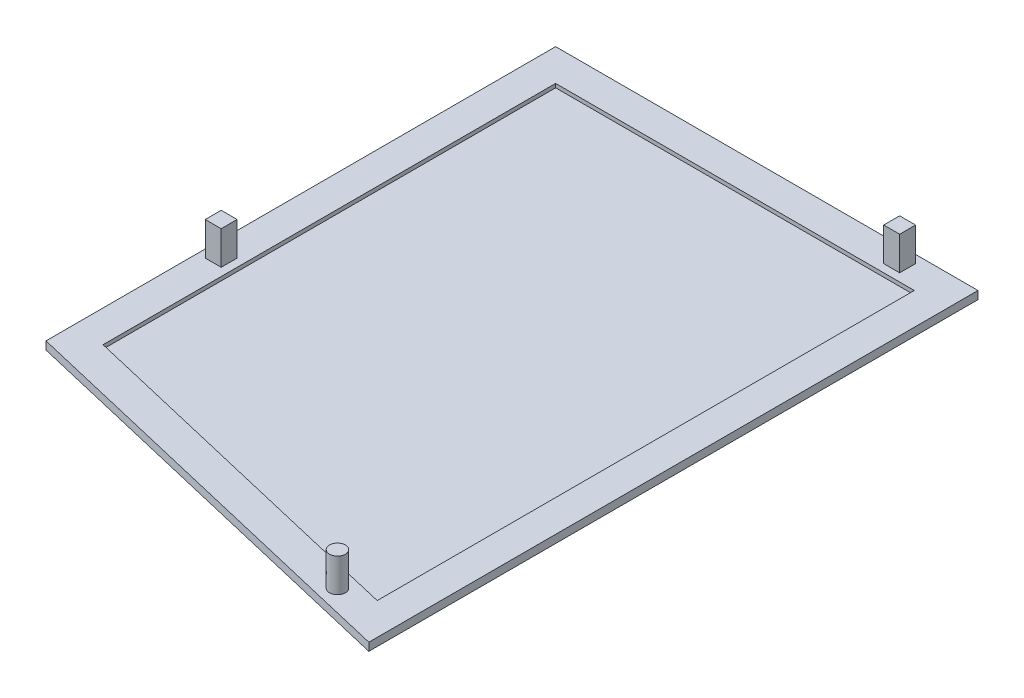
ISO-10303-21;
HEADER;
FILE_DESCRIPTION(('STEP AP214'),'2;1');
FILE_NAME('part.step','',(''),(''),'','','');
FILE_SCHEMA(('AUTOMOTIVE_DESIGN { 1 0 10303 214 1 1 1 1 }'));
ENDSEC;
DATA;
#1=APPLICATION_CONTEXT('core data for automotive mechanical design processes');
#2=APPLICATION_PROTOCOL_DEFINITION('international standard','automotive_design',2000,#1);
#3=PRODUCT_CONTEXT('',#1,'mechanical');
#4=PRODUCT('Part','Part','',(#3));
#5=PRODUCT_RELATED_PRODUCT_CATEGORY('part','',(#4));
#6=PRODUCT_DEFINITION_FORMATION('','',#4);
#7=PRODUCT_DEFINITION_CONTEXT('part definition',#1,'design');
#8=PRODUCT_DEFINITION('design','',#6,#7);
#9=PRODUCT_DEFINITION_SHAPE('','',#8);
#10=(LENGTH_UNIT() NAMED_UNIT(*) SI_UNIT(.MILLI.,.METRE.));
#11=(NAMED_UNIT(*) PLANE_ANGLE_UNIT() SI_UNIT($,.RADIAN.));
#12=(NAMED_UNIT(*) SI_UNIT($,.STERADIAN.) SOLID_ANGLE_UNIT());
#13=UNCERTAINTY_MEASURE_WITH_UNIT(LENGTH_MEASURE(1.E-05),#10,'distance_accuracy_value','');
#14=(GEOMETRIC_REPRESENTATION_CONTEXT(3) GLOBAL_UNCERTAINTY_ASSIGNED_CONTEXT((#13)) GLOBAL_UNIT_ASSIGNED_CONTEXT((#10,
#11,#12)) REPRESENTATION_CONTEXT('',''));
#15=CARTESIAN_POINT('',(0.,0.,0.));
#16=DIRECTION('',(0.,0.,1.));
#17=DIRECTION('',(1.,0.,0.));
#18=AXIS2_PLACEMENT_3D('',#15,#16,#17);
#19=CARTESIAN_POINT('',(66.3,1.25,15.6237913177201));
#20=DIRECTION('',(0.229370274159935,0.,-0.973339240620554));
#21=DIRECTION('',(-0.973339240620554,0.,-0.229370274159935));
#22=AXIS2_PLACEMENT_3D('',#19,#20,#21);
#23=PLANE('',#22);
#24=DIRECTION('',(0.973339240620554,0.,0.229370274159935));
#25=VECTOR('',#24,1.);
#26=CARTESIAN_POINT('',(66.3,0.,15.6237913177201));
#27=LINE('',#26,#25);
#28=CARTESIAN_POINT('',(0.,0.,0.));
#29=VERTEX_POINT('',#28);
#30=CARTESIAN_POINT('',(66.3,0.,15.6237913177201));
#31=VERTEX_POINT('',#30);
#32=EDGE_CURVE('E257',#29,#31,#27,.T.);
#33=ORIENTED_EDGE('',*,*,#32,.T.);
#34=DIRECTION('',(0.,-1.,0.));
#35=VECTOR('',#34,1.);
#36=CARTESIAN_POINT('',(66.3,1.25,15.6237913177201));
#37=LINE('',#36,#35);
#38=CARTESIAN_POINT('',(66.3,1.25,15.6237913177201));
#39=VERTEX_POINT('',#38);
#40=EDGE_CURVE('E11',#39,#31,#37,.T.);
#41=ORIENTED_EDGE('',*,*,#40,.F.);
#42=DIRECTION('',(0.973339240620554,0.,0.229370274159935));
#43=VECTOR('',#42,1.);
#44=CARTESIAN_POINT('',(66.3,1.25,15.6237913177201));
#45=LINE('',#44,#43);
#46=CARTESIAN_POINT('',(0.,1.25,0.));
#47=VERTEX_POINT('',#46);
#48=EDGE_CURVE('E258',#47,#39,#45,.T.);
#49=ORIENTED_EDGE('',*,*,#48,.F.);
#50=DIRECTION('',(0.,-1.,0.));
#51=VECTOR('',#50,1.);
#52=CARTESIAN_POINT('',(0.,1.25,0.));
#53=LINE('',#52,#51);
#54=EDGE_CURVE('E268',#47,#29,#53,.T.);
#55=ORIENTED_EDGE('',*,*,#54,.T.);
#56=EDGE_LOOP('',(#33,#41,#49,#55));
#57=FACE_BOUND('',#56,.T.);
#58=ADVANCED_FACE('F33',(#57),#23,.F.);
#59=CARTESIAN_POINT('',(66.3,1.25,-80.));
#60=DIRECTION('',(-1.,0.,0.));
#61=DIRECTION('',(0.,0.,1.));
#62=AXIS2_PLACEMENT_3D('',#59,#60,#61);
#63=PLANE('',#62);
#64=DIRECTION('',(0.,0.,-1.));
#65=VECTOR('',#64,1.);
#66=CARTESIAN_POINT('',(66.3,0.,-80.));
#67=LINE('',#66,#65);
#68=CARTESIAN_POINT('',(66.3,0.,-80.));
#69=VERTEX_POINT('',#68);
#70=EDGE_CURVE('E271',#31,#69,#67,.T.);
#71=ORIENTED_EDGE('',*,*,#70,.T.);
#72=DIRECTION('',(0.,-1.,0.));
#73=VECTOR('',#72,1.);
#74=CARTESIAN_POINT('',(66.3,1.25,-80.));
#75=LINE('',#74,#73);
#76=CARTESIAN_POINT('',(66.3,1.25,-80.));
#77=VERTEX_POINT('',#76);
#78=EDGE_CURVE('E40',#77,#69,#75,.T.);
#79=ORIENTED_EDGE('',*,*,#78,.F.);
#80=DIRECTION('',(0.,0.,-1.));
#81=VECTOR('',#80,1.);
#82=CARTESIAN_POINT('',(66.3,1.25,-80.));
#83=LINE('',#82,#81);
#84=EDGE_CURVE('E261',#39,#77,#83,.T.);
#85=ORIENTED_EDGE('',*,*,#84,.F.);
#86=ORIENTED_EDGE('',*,*,#40,.T.);
#87=EDGE_LOOP('',(#71,#79,#85,#86));
#88=FACE_BOUND('',#87,.T.);
#89=ADVANCED_FACE('F301',(#88),#63,.F.);
#90=CARTESIAN_POINT('',(0.,1.25,-80.));
#91=DIRECTION('',(0.,0.,1.));
#92=DIRECTION('',(1.,0.,0.));
#93=AXIS2_PLACEMENT_3D('',#90,#91,#92);
#94=PLANE('',#93);
#95=DIRECTION('',(-1.,0.,0.));
#96=VECTOR('',#95,1.);
#97=CARTESIAN_POINT('',(0.,0.,-80.));
#98=LINE('',#97,#96);
#99=CARTESIAN_POINT('',(0.,0.,-80.));
#100=VERTEX_POINT('',#99);
#101=EDGE_CURVE('E273',#69,#100,#98,.T.);
#102=ORIENTED_EDGE('',*,*,#101,.T.);
#103=DIRECTION('',(0.,-1.,0.));
#104=VECTOR('',#103,1.);
#105=CARTESIAN_POINT('',(0.,1.25,-80.));
#106=LINE('',#105,#104);
#107=CARTESIAN_POINT('',(0.,1.25,-80.));
#108=VERTEX_POINT('',#107);
#109=EDGE_CURVE('E278',#108,#100,#106,.T.);
#110=ORIENTED_EDGE('',*,*,#109,.F.);
#111=DIRECTION('',(-1.,0.,0.));
#112=VECTOR('',#111,1.);
#113=CARTESIAN_POINT('',(0.,1.25,-80.));
#114=LINE('',#113,#112);
#115=EDGE_CURVE('E264',#77,#108,#114,.T.);
#116=ORIENTED_EDGE('',*,*,#115,.F.);
#117=ORIENTED_EDGE('',*,*,#78,.T.);
#118=EDGE_LOOP('',(#102,#110,#116,#117));
#119=FACE_BOUND('',#118,.T.);
#120=ADVANCED_FACE('F285',(#119),#94,.F.);
#121=CARTESIAN_POINT('',(0.,1.25,0.));
#122=DIRECTION('',(1.,0.,0.));
#123=DIRECTION('',(0.,0.,-1.));
#124=AXIS2_PLACEMENT_3D('',#121,#122,#123);
#125=PLANE('',#124);
#126=DIRECTION('',(0.,0.,1.));
#127=VECTOR('',#126,1.);
#128=CARTESIAN_POINT('',(0.,0.,0.));
#129=LINE('',#128,#127);
#130=EDGE_CURVE('E262',#100,#29,#129,.T.);
#131=ORIENTED_EDGE('',*,*,#130,.T.);
#132=ORIENTED_EDGE('',*,*,#54,.F.);
#133=DIRECTION('',(0.,0.,1.));
#134=VECTOR('',#133,1.);
#135=CARTESIAN_POINT('',(0.,1.25,0.));
#136=LINE('',#135,#134);
#137=EDGE_CURVE('E266',#108,#47,#136,.T.);
#138=ORIENTED_EDGE('',*,*,#137,.F.);
#139=ORIENTED_EDGE('',*,*,#109,.T.);
#140=EDGE_LOOP('',(#131,#132,#138,#139));
#141=FACE_BOUND('',#140,.T.);
#142=ADVANCED_FACE('F294',(#141),#125,.F.);
#143=CARTESIAN_POINT('',(0.,1.25,0.));
#144=DIRECTION('',(0.,-1.,0.));
#145=DIRECTION('',(0.,0.,-1.));
#146=AXIS2_PLACEMENT_3D('',#143,#144,#145);
#147=PLANE('',#146);
#148=DIRECTION('',(0.,0.,1.));
#149=VECTOR('',#148,1.);
#150=CARTESIAN_POINT('',(5.,1.25,-75.));
#151=LINE('',#150,#149);
#152=CARTESIAN_POINT('',(5.,1.25,-75.));
#153=VERTEX_POINT('',#152);
#154=CARTESIAN_POINT('',(5.,1.25,-3.95869031925986));
#155=VERTEX_POINT('',#154);
#156=EDGE_CURVE('E174',#153,#155,#151,.T.);
#157=ORIENTED_EDGE('',*,*,#156,.F.);
#158=DIRECTION('',(-1.,0.,0.));
#159=VECTOR('',#158,1.);
#160=CARTESIAN_POINT('',(61.3,1.25,-75.));
#161=LINE('',#160,#159);
#162=CARTESIAN_POINT('',(61.3,1.25,-75.));
#163=VERTEX_POINT('',#162);
#164=EDGE_CURVE('E47',#163,#153,#161,.T.);
#165=ORIENTED_EDGE('',*,*,#164,.F.);
#166=DIRECTION('',(0.,0.,-1.));
#167=VECTOR('',#166,1.);
#168=CARTESIAN_POINT('',(61.3,1.25,9.30857138794438));
#169=LINE('',#168,#167);
#170=CARTESIAN_POINT('',(61.3,1.25,9.30857138794438));
#171=VERTEX_POINT('',#170);
#172=EDGE_CURVE('E165',#171,#163,#169,.T.);
#173=ORIENTED_EDGE('',*,*,#172,.F.);
#174=DIRECTION('',(0.973339240620554,0.,0.229370274159935));
#175=VECTOR('',#174,1.);
#176=CARTESIAN_POINT('',(5.,1.25,-3.95869031925986));
#177=LINE('',#176,#175);
#178=EDGE_CURVE('E168',#155,#171,#177,.T.);
#179=ORIENTED_EDGE('',*,*,#178,.F.);
#180=EDGE_LOOP('',(#157,#165,#173,#179));
#181=FACE_BOUND('',#180,.T.);
#182=DIRECTION('',(1.,0.,0.));
#183=VECTOR('',#182,1.);
#184=CARTESIAN_POINT('',(0.,1.25,-26.25));
#185=LINE('',#184,#183);
#186=CARTESIAN_POINT('',(1.25,1.25,-26.25));
#187=VERTEX_POINT('',#186);
#188=CARTESIAN_POINT('',(3.75,1.25,-26.25));
#189=VERTEX_POINT('',#188);
#190=EDGE_CURVE('E210',#187,#189,#185,.T.);
#191=ORIENTED_EDGE('',*,*,#190,.T.);
#192=DIRECTION('',(0.,0.,1.));
#193=VECTOR('',#192,1.);
#194=CARTESIAN_POINT('',(3.75,1.25,0.));
#195=LINE('',#194,#193);
#196=CARTESIAN_POINT('',(3.75,1.25,-23.75));
#197=VERTEX_POINT('',#196);
#198=EDGE_CURVE('E213',#189,#197,#195,.T.);
#199=ORIENTED_EDGE('',*,*,#198,.T.);
#200=DIRECTION('',(-1.,0.,0.));
#201=VECTOR('',#200,1.);
#202=CARTESIAN_POINT('',(0.,1.25,-23.75));
#203=LINE('',#202,#201);
#204=CARTESIAN_POINT('',(1.25,1.25,-23.75));
#205=VERTEX_POINT('',#204);
#206=EDGE_CURVE('E198',#197,#205,#203,.T.);
#207=ORIENTED_EDGE('',*,*,#206,.T.);
#208=DIRECTION('',(0.,0.,-1.));
#209=VECTOR('',#208,1.);
#210=CARTESIAN_POINT('',(1.25,1.25,0.));
#211=LINE('',#210,#209);
#212=EDGE_CURVE('E207',#205,#187,#211,.T.);
#213=ORIENTED_EDGE('',*,*,#212,.T.);
#214=EDGE_LOOP('',(#191,#199,#207,#213));
#215=FACE_BOUND('',#214,.T.);
#216=DIRECTION('',(1.,0.,0.));
#217=VECTOR('',#216,1.);
#218=CARTESIAN_POINT('',(0.,1.25,-78.75));
#219=LINE('',#218,#217);
#220=CARTESIAN_POINT('',(55.25,1.25,-78.75));
#221=VERTEX_POINT('',#220);
#222=CARTESIAN_POINT('',(57.75,1.25,-78.75));
#223=VERTEX_POINT('',#222);
#224=EDGE_CURVE('E245',#221,#223,#219,.T.);
#225=ORIENTED_EDGE('',*,*,#224,.T.);
#226=DIRECTION('',(0.,0.,1.));
#227=VECTOR('',#226,1.);
#228=CARTESIAN_POINT('',(57.75,1.25,0.));
#229=LINE('',#228,#227);
#230=CARTESIAN_POINT('',(57.75,1.25,-76.25));
#231=VERTEX_POINT('',#230);
#232=EDGE_CURVE('E248',#223,#231,#229,.T.);
#233=ORIENTED_EDGE('',*,*,#232,.T.);
#234=DIRECTION('',(-1.,0.,0.));
#235=VECTOR('',#234,1.);
#236=CARTESIAN_POINT('',(0.,1.25,-76.25));
#237=LINE('',#236,#235);
#238=CARTESIAN_POINT('',(55.25,1.25,-76.25));
#239=VERTEX_POINT('',#238);
#240=EDGE_CURVE('E232',#231,#239,#237,.T.);
#241=ORIENTED_EDGE('',*,*,#240,.T.);
#242=DIRECTION('',(0.,0.,-1.));
#243=VECTOR('',#242,1.);
#244=CARTESIAN_POINT('',(55.25,1.25,0.));
#245=LINE('',#244,#243);
#246=EDGE_CURVE('E242',#239,#221,#245,.T.);
#247=ORIENTED_EDGE('',*,*,#246,.T.);
#248=EDGE_LOOP('',(#225,#233,#241,#247));
#249=FACE_BOUND('',#248,.T.);
#250=CARTESIAN_POINT('',(56.5,1.25,10.7459147371557));
#251=DIRECTION('',(0.,-1.,0.));
#252=DIRECTION('',(0.,0.,-1.));
#253=AXIS2_PLACEMENT_3D('',#250,#251,#252);
#254=CIRCLE('',#253,1.25);
#255=CARTESIAN_POINT('',(56.5,1.25,9.49591473715566));
#256=VERTEX_POINT('',#255);
#257=EDGE_CURVE('E254',#256,#256,#254,.T.);
#258=ORIENTED_EDGE('',*,*,#257,.T.);
#259=EDGE_LOOP('',(#258));
#260=FACE_BOUND('',#259,.T.);
#261=ORIENTED_EDGE('',*,*,#48,.T.);
#262=ORIENTED_EDGE('',*,*,#84,.T.);
#263=ORIENTED_EDGE('',*,*,#115,.T.);
#264=ORIENTED_EDGE('',*,*,#137,.T.);
#265=EDGE_LOOP('',(#261,#262,#263,#264));
#266=FACE_BOUND('',#265,.T.);
#267=ADVANCED_FACE('F300',(#181,#215,#249,#260,#266),#147,.F.);
#268=CARTESIAN_POINT('',(0.,0.,0.));
#269=DIRECTION('',(0.,-1.,0.));
#270=DIRECTION('',(0.,0.,-1.));
#271=AXIS2_PLACEMENT_3D('',#268,#269,#270);
#272=PLANE('',#271);
#273=ORIENTED_EDGE('',*,*,#32,.F.);
#274=ORIENTED_EDGE('',*,*,#130,.F.);
#275=ORIENTED_EDGE('',*,*,#101,.F.);
#276=ORIENTED_EDGE('',*,*,#70,.F.);
#277=EDGE_LOOP('',(#273,#274,#275,#276));
#278=FACE_BOUND('',#277,.T.);
#279=ADVANCED_FACE('F291',(#278),#272,.T.);
#280=CARTESIAN_POINT('',(56.5,6.5,10.7459147371557));
#281=DIRECTION('',(0.,-1.,0.));
#282=DIRECTION('',(0.,0.,-1.));
#283=AXIS2_PLACEMENT_3D('',#280,#281,#282);
#284=CYLINDRICAL_SURFACE('',#283,1.25);
#285=CARTESIAN_POINT('',(56.5,6.5,10.7459147371557));
#286=DIRECTION('',(0.,-1.,0.));
#287=DIRECTION('',(0.,0.,-1.));
#288=AXIS2_PLACEMENT_3D('',#285,#286,#287);
#289=CIRCLE('',#288,1.25);
#290=CARTESIAN_POINT('',(56.5,6.5,9.49591473715566));
#291=VERTEX_POINT('',#290);
#292=EDGE_CURVE('E251',#291,#291,#289,.T.);
#293=CARTESIAN_POINT('',(56.5,6.5,9.49591473715566));
#294=CARTESIAN_POINT('',(56.5,6.4453125,9.49591473715566));
#295=CARTESIAN_POINT('',(56.5,6.390625,9.49591473715566));
#296=CARTESIAN_POINT('',(56.5,6.28125,9.49591473715566));
#297=CARTESIAN_POINT('',(56.5,6.2265625,9.49591473715566));
#298=CARTESIAN_POINT('',(56.5,6.1171875,9.49591473715566));
#299=CARTESIAN_POINT('',(56.5,6.0625,9.49591473715566));
#300=CARTESIAN_POINT('',(56.5,5.953125,9.49591473715566));
#301=CARTESIAN_POINT('',(56.5,5.8984375,9.49591473715566));
#302=CARTESIAN_POINT('',(56.5,5.7890625,9.49591473715566));
#303=CARTESIAN_POINT('',(56.5,5.734375,9.49591473715566));
#304=CARTESIAN_POINT('',(56.5,5.625,9.49591473715566));
#305=CARTESIAN_POINT('',(56.5,5.5703125,9.49591473715566));
#306=CARTESIAN_POINT('',(56.5,5.4609375,9.49591473715566));
#307=CARTESIAN_POINT('',(56.5,5.40625,9.49591473715566));
#308=CARTESIAN_POINT('',(56.5,5.296875,9.49591473715566));
#309=CARTESIAN_POINT('',(56.5,5.2421875,9.49591473715566));
#310=CARTESIAN_POINT('',(56.5,5.1328125,9.49591473715566));
#311=CARTESIAN_POINT('',(56.5,5.078125,9.49591473715566));
#312=CARTESIAN_POINT('',(56.5,4.96875,9.49591473715566));
#313=CARTESIAN_POINT('',(56.5,4.9140625,9.49591473715566));
#314=CARTESIAN_POINT('',(56.5,4.8046875,9.49591473715566));
#315=CARTESIAN_POINT('',(56.5,4.75,9.49591473715566));
#316=CARTESIAN_POINT('',(56.5,4.640625,9.49591473715566));
#317=CARTESIAN_POINT('',(56.5,4.5859375,9.49591473715566));
#318=CARTESIAN_POINT('',(56.5,4.4765625,9.49591473715566));
#319=CARTESIAN_POINT('',(56.5,4.421875,9.49591473715566));
#320=CARTESIAN_POINT('',(56.5,4.3125,9.49591473715566));
#321=CARTESIAN_POINT('',(56.5,4.2578125,9.49591473715566));
#322=CARTESIAN_POINT('',(56.5,4.1484375,9.49591473715566));
#323=CARTESIAN_POINT('',(56.5,4.09375,9.49591473715566));
#324=CARTESIAN_POINT('',(56.5,3.984375,9.49591473715566));
#325=CARTESIAN_POINT('',(56.5,3.9296875,9.49591473715566));
#326=CARTESIAN_POINT('',(56.5,3.8203125,9.49591473715566));
#327=CARTESIAN_POINT('',(56.5,3.765625,9.49591473715566));
#328=CARTESIAN_POINT('',(56.5,3.65625,9.49591473715566));
#329=CARTESIAN_POINT('',(56.5,3.6015625,9.49591473715566));
#330=CARTESIAN_POINT('',(56.5,3.4921875,9.49591473715566));
#331=CARTESIAN_POINT('',(56.5,3.4375,9.49591473715566));
#332=CARTESIAN_POINT('',(56.5,3.328125,9.49591473715566));
#333=CARTESIAN_POINT('',(56.5,3.2734375,9.49591473715566));
#334=CARTESIAN_POINT('',(56.5,3.1640625,9.49591473715566));
#335=CARTESIAN_POINT('',(56.5,3.109375,9.49591473715566));
#336=CARTESIAN_POINT('',(56.5,3.,9.49591473715566));
#337=CARTESIAN_POINT('',(56.5,2.9453125,9.49591473715566));
#338=CARTESIAN_POINT('',(56.5,2.8359375,9.49591473715566));
#339=CARTESIAN_POINT('',(56.5,2.78125,9.49591473715566));
#340=CARTESIAN_POINT('',(56.5,2.671875,9.49591473715566));
#341=CARTESIAN_POINT('',(56.5,2.6171875,9.49591473715566));
#342=CARTESIAN_POINT('',(56.5,2.5078125,9.49591473715566));
#343=CARTESIAN_POINT('',(56.5,2.453125,9.49591473715566));
#344=CARTESIAN_POINT('',(56.5,2.34375,9.49591473715566));
#345=CARTESIAN_POINT('',(56.5,2.2890625,9.49591473715566));
#346=CARTESIAN_POINT('',(56.5,2.1796875,9.49591473715566));
#347=CARTESIAN_POINT('',(56.5,2.125,9.49591473715566));
#348=CARTESIAN_POINT('',(56.5,2.015625,9.49591473715566));
#349=CARTESIAN_POINT('',(56.5,1.9609375,9.49591473715566));
#350=CARTESIAN_POINT('',(56.5,1.8515625,9.49591473715566));
#351=CARTESIAN_POINT('',(56.5,1.796875,9.49591473715566));
#352=CARTESIAN_POINT('',(56.5,1.6875,9.49591473715566));
#353=CARTESIAN_POINT('',(56.5,1.6328125,9.49591473715566));
#354=CARTESIAN_POINT('',(56.5,1.5234375,9.49591473715566));
#355=CARTESIAN_POINT('',(56.5,1.46875,9.49591473715566));
#356=CARTESIAN_POINT('',(56.5,1.359375,9.49591473715566));
#357=CARTESIAN_POINT('',(56.5,1.3046875,9.49591473715566));
#358=CARTESIAN_POINT('',(56.5,1.25,9.49591473715566));
#359=B_SPLINE_CURVE_WITH_KNOTS('',3,(#293,#294,#295,#296,#297,#298,#299,#300,#301,#302,#303,
#304,#305,#306,#307,#308,#309,#310,#311,#312,#313,#314,#315,#316,#317,#318,#319,#320,#321,#322,
#323,#324,#325,#326,#327,#328,#329,#330,#331,#332,#333,#334,#335,#336,#337,#338,#339,#340,#341,
#342,#343,#344,#345,#346,#347,#348,#349,#350,#351,#352,#353,#354,#355,#356,#357,#358),
.UNSPECIFIED.,.F.,.F.,(4,2,2,2,2,2,2,2,2,2,2,2,2,2,2,2,2,2,2,2,2,2,2,2,2,2,2,2,2,2,2,2,4),(0.,
0.1640625,0.328125,0.4921875,0.656250000000001,0.820312500000001,0.984375,1.1484375,1.3125,
1.4765625,1.640625,1.8046875,1.96875,2.1328125,2.296875,2.4609375,2.625,2.7890625,2.953125,
3.1171875,3.28125,3.4453125,3.609375,3.7734375,3.9375,4.1015625,4.265625,4.4296875,4.59375,
4.7578125,4.921875,5.0859375,5.25),.UNSPECIFIED.);
#360=EDGE_CURVE('BSEAM313',#291,#256,#359,.T.);
#361=ORIENTED_EDGE('',*,*,#292,.T.);
#362=ORIENTED_EDGE('',*,*,#257,.F.);
#363=ORIENTED_EDGE('',*,*,#360,.T.);
#364=ORIENTED_EDGE('',*,*,#360,.F.);
#365=EDGE_LOOP('',(#361,#363,#362,#364));
#366=FACE_BOUND('',#365,.T.);
#367=ADVANCED_FACE('F313',(#366),#284,.T.);
#368=CARTESIAN_POINT('',(56.5,6.5,10.7459147371557));
#369=DIRECTION('',(0.,-1.,0.));
#370=DIRECTION('',(0.,0.,-1.));
#371=AXIS2_PLACEMENT_3D('',#368,#369,#370);
#372=PLANE('',#371);
#373=ORIENTED_EDGE('',*,*,#292,.F.);
#374=EDGE_LOOP('',(#373));
#375=FACE_BOUND('',#374,.T.);
#376=ADVANCED_FACE('F319',(#375),#372,.F.);
#377=CARTESIAN_POINT('',(57.75,6.5,-78.75));
#378=DIRECTION('',(1.,0.,0.));
#379=DIRECTION('',(0.,0.,-1.));
#380=AXIS2_PLACEMENT_3D('',#377,#378,#379);
#381=PLANE('',#380);
#382=ORIENTED_EDGE('',*,*,#232,.F.);
#383=DIRECTION('',(0.,-1.,0.));
#384=VECTOR('',#383,1.);
#385=CARTESIAN_POINT('',(57.75,6.5,-78.75));
#386=LINE('',#385,#384);
#387=CARTESIAN_POINT('',(57.75,6.5,-78.75));
#388=VERTEX_POINT('',#387);
#389=EDGE_CURVE('E229',#388,#223,#386,.T.);
#390=ORIENTED_EDGE('',*,*,#389,.F.);
#391=DIRECTION('',(0.,0.,1.));
#392=VECTOR('',#391,1.);
#393=CARTESIAN_POINT('',(57.75,6.5,-78.75));
#394=LINE('',#393,#392);
#395=CARTESIAN_POINT('',(57.75,6.5,-76.25));
#396=VERTEX_POINT('',#395);
#397=EDGE_CURVE('E216',#388,#396,#394,.T.);
#398=ORIENTED_EDGE('',*,*,#397,.T.);
#399=DIRECTION('',(0.,-1.,0.));
#400=VECTOR('',#399,1.);
#401=CARTESIAN_POINT('',(57.75,6.5,-76.25));
#402=LINE('',#401,#400);
#403=EDGE_CURVE('E228',#396,#231,#402,.T.);
#404=ORIENTED_EDGE('',*,*,#403,.T.);
#405=EDGE_LOOP('',(#382,#390,#398,#404));
#406=FACE_BOUND('',#405,.T.);
#407=ADVANCED_FACE('F323',(#406),#381,.T.);
#408=CARTESIAN_POINT('',(57.75,6.5,-78.75));
#409=DIRECTION('',(0.,0.,-1.));
#410=DIRECTION('',(-1.,0.,0.));
#411=AXIS2_PLACEMENT_3D('',#408,#409,#410);
#412=PLANE('',#411);
#413=ORIENTED_EDGE('',*,*,#224,.F.);
#414=DIRECTION('',(0.,-1.,0.));
#415=VECTOR('',#414,1.);
#416=CARTESIAN_POINT('',(55.25,6.5,-78.75));
#417=LINE('',#416,#415);
#418=CARTESIAN_POINT('',(55.25,6.5,-78.75));
#419=VERTEX_POINT('',#418);
#420=EDGE_CURVE('E233',#419,#221,#417,.T.);
#421=ORIENTED_EDGE('',*,*,#420,.F.);
#422=DIRECTION('',(1.,0.,0.));
#423=VECTOR('',#422,1.);
#424=CARTESIAN_POINT('',(57.75,6.5,-78.75));
#425=LINE('',#424,#423);
#426=EDGE_CURVE('E225',#419,#388,#425,.T.);
#427=ORIENTED_EDGE('',*,*,#426,.T.);
#428=ORIENTED_EDGE('',*,*,#389,.T.);
#429=EDGE_LOOP('',(#413,#421,#427,#428));
#430=FACE_BOUND('',#429,.T.);
#431=ADVANCED_FACE('F327',(#430),#412,.T.);
#432=CARTESIAN_POINT('',(55.25,6.5,-78.75));
#433=DIRECTION('',(-1.,0.,0.));
#434=DIRECTION('',(0.,0.,1.));
#435=AXIS2_PLACEMENT_3D('',#432,#433,#434);
#436=PLANE('',#435);
#437=ORIENTED_EDGE('',*,*,#246,.F.);
#438=DIRECTION('',(0.,-1.,0.));
#439=VECTOR('',#438,1.);
#440=CARTESIAN_POINT('',(55.25,6.5,-76.25));
#441=LINE('',#440,#439);
#442=CARTESIAN_POINT('',(55.25,6.5,-76.25));
#443=VERTEX_POINT('',#442);
#444=EDGE_CURVE('E236',#443,#239,#441,.T.);
#445=ORIENTED_EDGE('',*,*,#444,.F.);
#446=DIRECTION('',(0.,0.,-1.));
#447=VECTOR('',#446,1.);
#448=CARTESIAN_POINT('',(55.25,6.5,-78.75));
#449=LINE('',#448,#447);
#450=EDGE_CURVE('E222',#443,#419,#449,.T.);
#451=ORIENTED_EDGE('',*,*,#450,.T.);
#452=ORIENTED_EDGE('',*,*,#420,.T.);
#453=EDGE_LOOP('',(#437,#445,#451,#452));
#454=FACE_BOUND('',#453,.T.);
#455=ADVANCED_FACE('F333',(#454),#436,.T.);
#456=CARTESIAN_POINT('',(57.75,6.5,-76.25));
#457=DIRECTION('',(0.,0.,1.));
#458=DIRECTION('',(1.,0.,0.));
#459=AXIS2_PLACEMENT_3D('',#456,#457,#458);
#460=PLANE('',#459);
#461=ORIENTED_EDGE('',*,*,#240,.F.);
#462=ORIENTED_EDGE('',*,*,#403,.F.);
#463=DIRECTION('',(-1.,0.,0.));
#464=VECTOR('',#463,1.);
#465=CARTESIAN_POINT('',(57.75,6.5,-76.25));
#466=LINE('',#465,#464);
#467=EDGE_CURVE('E219',#396,#443,#466,.T.);
#468=ORIENTED_EDGE('',*,*,#467,.T.);
#469=ORIENTED_EDGE('',*,*,#444,.T.);
#470=EDGE_LOOP('',(#461,#462,#468,#469));
#471=FACE_BOUND('',#470,.T.);
#472=ADVANCED_FACE('F329',(#471),#460,.T.);
#473=CARTESIAN_POINT('',(0.,6.5,0.));
#474=DIRECTION('',(0.,-1.,0.));
#475=DIRECTION('',(0.,0.,-1.));
#476=AXIS2_PLACEMENT_3D('',#473,#474,#475);
#477=PLANE('',#476);
#478=ORIENTED_EDGE('',*,*,#397,.F.);
#479=ORIENTED_EDGE('',*,*,#426,.F.);
#480=ORIENTED_EDGE('',*,*,#450,.F.);
#481=ORIENTED_EDGE('',*,*,#467,.F.);
#482=EDGE_LOOP('',(#478,#479,#480,#481));
#483=FACE_BOUND('',#482,.T.);
#484=ADVANCED_FACE('F332',(#483),#477,.F.);
#485=CARTESIAN_POINT('',(3.75,6.5,-26.25));
#486=DIRECTION('',(1.,0.,0.));
#487=DIRECTION('',(0.,0.,-1.));
#488=AXIS2_PLACEMENT_3D('',#485,#486,#487);
#489=PLANE('',#488);
#490=ORIENTED_EDGE('',*,*,#198,.F.);
#491=DIRECTION('',(0.,-1.,0.));
#492=VECTOR('',#491,1.);
#493=CARTESIAN_POINT('',(3.75,6.5,-26.25));
#494=LINE('',#493,#492);
#495=CARTESIAN_POINT('',(3.75,6.5,-26.25));
#496=VERTEX_POINT('',#495);
#497=EDGE_CURVE('E195',#496,#189,#494,.T.);
#498=ORIENTED_EDGE('',*,*,#497,.F.);
#499=DIRECTION('',(0.,0.,1.));
#500=VECTOR('',#499,1.);
#501=CARTESIAN_POINT('',(3.75,6.5,-26.25));
#502=LINE('',#501,#500);
#503=CARTESIAN_POINT('',(3.75,6.5,-23.75));
#504=VERTEX_POINT('',#503);
#505=EDGE_CURVE('E180',#496,#504,#502,.T.);
#506=ORIENTED_EDGE('',*,*,#505,.T.);
#507=DIRECTION('',(0.,-1.,0.));
#508=VECTOR('',#507,1.);
#509=CARTESIAN_POINT('',(3.75,6.5,-23.75));
#510=LINE('',#509,#508);
#511=EDGE_CURVE('E194',#504,#197,#510,.T.);
#512=ORIENTED_EDGE('',*,*,#511,.T.);
#513=EDGE_LOOP('',(#490,#498,#506,#512));
#514=FACE_BOUND('',#513,.T.);
#515=ADVANCED_FACE('F343',(#514),#489,.T.);
#516=CARTESIAN_POINT('',(3.75,6.5,-26.25));
#517=DIRECTION('',(0.,0.,-1.));
#518=DIRECTION('',(-1.,0.,0.));
#519=AXIS2_PLACEMENT_3D('',#516,#517,#518);
#520=PLANE('',#519);
#521=ORIENTED_EDGE('',*,*,#190,.F.);
#522=DIRECTION('',(0.,-1.,0.));
#523=VECTOR('',#522,1.);
#524=CARTESIAN_POINT('',(1.25,6.5,-26.25));
#525=LINE('',#524,#523);
#526=CARTESIAN_POINT('',(1.25,6.5,-26.25));
#527=VERTEX_POINT('',#526);
#528=EDGE_CURVE('E199',#527,#187,#525,.T.);
#529=ORIENTED_EDGE('',*,*,#528,.F.);
#530=DIRECTION('',(1.,0.,0.));
#531=VECTOR('',#530,1.);
#532=CARTESIAN_POINT('',(3.75,6.5,-26.25));
#533=LINE('',#532,#531);
#534=EDGE_CURVE('E191',#527,#496,#533,.T.);
#535=ORIENTED_EDGE('',*,*,#534,.T.);
#536=ORIENTED_EDGE('',*,*,#497,.T.);
#537=EDGE_LOOP('',(#521,#529,#535,#536));
#538=FACE_BOUND('',#537,.T.);
#539=ADVANCED_FACE('F347',(#538),#520,.T.);
#540=CARTESIAN_POINT('',(1.25,6.5,-26.25));
#541=DIRECTION('',(-1.,0.,0.));
#542=DIRECTION('',(0.,0.,1.));
#543=AXIS2_PLACEMENT_3D('',#540,#541,#542);
#544=PLANE('',#543);
#545=ORIENTED_EDGE('',*,*,#212,.F.);
#546=DIRECTION('',(0.,-1.,0.));
#547=VECTOR('',#546,1.);
#548=CARTESIAN_POINT('',(1.25,6.5,-23.75));
#549=LINE('',#548,#547);
#550=CARTESIAN_POINT('',(1.25,6.5,-23.75));
#551=VERTEX_POINT('',#550);
#552=EDGE_CURVE('E55',#551,#205,#549,.T.);
#553=ORIENTED_EDGE('',*,*,#552,.F.);
#554=DIRECTION('',(0.,0.,-1.));
#555=VECTOR('',#554,1.);
#556=CARTESIAN_POINT('',(1.25,6.5,-26.25));
#557=LINE('',#556,#555);
#558=EDGE_CURVE('E188',#551,#527,#557,.T.);
#559=ORIENTED_EDGE('',*,*,#558,.T.);
#560=ORIENTED_EDGE('',*,*,#528,.T.);
#561=EDGE_LOOP('',(#545,#553,#559,#560));
#562=FACE_BOUND('',#561,.T.);
#563=ADVANCED_FACE('F353',(#562),#544,.T.);
#564=CARTESIAN_POINT('',(3.75,6.5,-23.75));
#565=DIRECTION('',(0.,0.,1.));
#566=DIRECTION('',(1.,0.,0.));
#567=AXIS2_PLACEMENT_3D('',#564,#565,#566);
#568=PLANE('',#567);
#569=ORIENTED_EDGE('',*,*,#206,.F.);
#570=ORIENTED_EDGE('',*,*,#511,.F.);
#571=DIRECTION('',(-1.,0.,0.));
#572=VECTOR('',#571,1.);
#573=CARTESIAN_POINT('',(3.75,6.5,-23.75));
#574=LINE('',#573,#572);
#575=EDGE_CURVE('E186',#504,#551,#574,.T.);
#576=ORIENTED_EDGE('',*,*,#575,.T.);
#577=ORIENTED_EDGE('',*,*,#552,.T.);
#578=EDGE_LOOP('',(#569,#570,#576,#577));
#579=FACE_BOUND('',#578,.T.);
#580=ADVANCED_FACE('F349',(#579),#568,.T.);
#581=CARTESIAN_POINT('',(0.,6.5,0.));
#582=DIRECTION('',(0.,-1.,0.));
#583=DIRECTION('',(0.,0.,-1.));
#584=AXIS2_PLACEMENT_3D('',#581,#582,#583);
#585=PLANE('',#584);
#586=ORIENTED_EDGE('',*,*,#505,.F.);
#587=ORIENTED_EDGE('',*,*,#534,.F.);
#588=ORIENTED_EDGE('',*,*,#558,.F.);
#589=ORIENTED_EDGE('',*,*,#575,.F.);
#590=EDGE_LOOP('',(#586,#587,#588,#589));
#591=FACE_BOUND('',#590,.T.);
#592=ADVANCED_FACE('F352',(#591),#585,.F.);
#593=CARTESIAN_POINT('',(61.3,0.65,-75.));
#594=DIRECTION('',(0.,0.,-1.));
#595=DIRECTION('',(-1.,0.,0.));
#596=AXIS2_PLACEMENT_3D('',#593,#594,#595);
#597=PLANE('',#596);
#598=ORIENTED_EDGE('',*,*,#164,.T.);
#599=DIRECTION('',(0.,1.,0.));
#600=VECTOR('',#599,1.);
#601=CARTESIAN_POINT('',(5.,0.65,-75.));
#602=LINE('',#601,#600);
#603=CARTESIAN_POINT('',(5.,0.65,-75.));
#604=VERTEX_POINT('',#603);
#605=EDGE_CURVE('E143',#604,#153,#602,.T.);
#606=ORIENTED_EDGE('',*,*,#605,.F.);
#607=DIRECTION('',(-1.,0.,0.));
#608=VECTOR('',#607,1.);
#609=CARTESIAN_POINT('',(61.3,0.65,-75.));
#610=LINE('',#609,#608);
#611=CARTESIAN_POINT('',(61.3,0.65,-75.));
#612=VERTEX_POINT('',#611);
#613=EDGE_CURVE('E147',#612,#604,#610,.T.);
#614=ORIENTED_EDGE('',*,*,#613,.F.);
#615=DIRECTION('',(0.,1.,0.));
#616=VECTOR('',#615,1.);
#617=CARTESIAN_POINT('',(61.3,0.65,-75.));
#618=LINE('',#617,#616);
#619=EDGE_CURVE('E178',#612,#163,#618,.T.);
#620=ORIENTED_EDGE('',*,*,#619,.T.);
#621=EDGE_LOOP('',(#598,#606,#614,#620));
#622=FACE_BOUND('',#621,.T.);
#623=ADVANCED_FACE('F145',(#622),#597,.F.);
#624=CARTESIAN_POINT('',(61.3,0.65,9.30857138794438));
#625=DIRECTION('',(1.,0.,0.));
#626=DIRECTION('',(0.,0.,-1.));
#627=AXIS2_PLACEMENT_3D('',#624,#625,#626);
#628=PLANE('',#627);
#629=ORIENTED_EDGE('',*,*,#172,.T.);
#630=ORIENTED_EDGE('',*,*,#619,.F.);
#631=DIRECTION('',(0.,0.,-1.));
#632=VECTOR('',#631,1.);
#633=CARTESIAN_POINT('',(61.3,0.65,9.30857138794438));
#634=LINE('',#633,#632);
#635=CARTESIAN_POINT('',(61.3,0.65,9.30857138794438));
#636=VERTEX_POINT('',#635);
#637=EDGE_CURVE('E153',#636,#612,#634,.T.);
#638=ORIENTED_EDGE('',*,*,#637,.F.);
#639=DIRECTION('',(0.,1.,0.));
#640=VECTOR('',#639,1.);
#641=CARTESIAN_POINT('',(61.3,0.65,9.30857138794438));
#642=LINE('',#641,#640);
#643=EDGE_CURVE('E181',#636,#171,#642,.T.);
#644=ORIENTED_EDGE('',*,*,#643,.T.);
#645=EDGE_LOOP('',(#629,#630,#638,#644));
#646=FACE_BOUND('',#645,.T.);
#647=ADVANCED_FACE('F365',(#646),#628,.F.);
#648=CARTESIAN_POINT('',(5.,0.65,-3.95869031925986));
#649=DIRECTION('',(-0.229370274159935,0.,0.973339240620554));
#650=DIRECTION('',(0.973339240620554,0.,0.229370274159935));
#651=AXIS2_PLACEMENT_3D('',#648,#649,#650);
#652=PLANE('',#651);
#653=ORIENTED_EDGE('',*,*,#178,.T.);
#654=ORIENTED_EDGE('',*,*,#643,.F.);
#655=DIRECTION('',(0.973339240620554,0.,0.229370274159935));
#656=VECTOR('',#655,1.);
#657=CARTESIAN_POINT('',(5.,0.65,-3.95869031925986));
#658=LINE('',#657,#656);
#659=CARTESIAN_POINT('',(5.,0.65,-3.95869031925986));
#660=VERTEX_POINT('',#659);
#661=EDGE_CURVE('E161',#660,#636,#658,.T.);
#662=ORIENTED_EDGE('',*,*,#661,.F.);
#663=DIRECTION('',(0.,1.,0.));
#664=VECTOR('',#663,1.);
#665=CARTESIAN_POINT('',(5.,0.65,-3.95869031925986));
#666=LINE('',#665,#664);
#667=EDGE_CURVE('E152',#660,#155,#666,.T.);
#668=ORIENTED_EDGE('',*,*,#667,.T.);
#669=EDGE_LOOP('',(#653,#654,#662,#668));
#670=FACE_BOUND('',#669,.T.);
#671=ADVANCED_FACE('F368',(#670),#652,.F.);
#672=CARTESIAN_POINT('',(5.,0.65,-75.));
#673=DIRECTION('',(-1.,0.,0.));
#674=DIRECTION('',(0.,0.,1.));
#675=AXIS2_PLACEMENT_3D('',#672,#673,#674);
#676=PLANE('',#675);
#677=ORIENTED_EDGE('',*,*,#156,.T.);
#678=ORIENTED_EDGE('',*,*,#667,.F.);
#679=DIRECTION('',(0.,0.,1.));
#680=VECTOR('',#679,1.);
#681=CARTESIAN_POINT('',(5.,0.65,-75.));
#682=LINE('',#681,#680);
#683=EDGE_CURVE('E156',#604,#660,#682,.T.);
#684=ORIENTED_EDGE('',*,*,#683,.F.);
#685=ORIENTED_EDGE('',*,*,#605,.T.);
#686=EDGE_LOOP('',(#677,#678,#684,#685));
#687=FACE_BOUND('',#686,.T.);
#688=ADVANCED_FACE('F157',(#687),#676,.F.);
#689=CARTESIAN_POINT('',(0.,0.65,0.));
#690=DIRECTION('',(0.,1.,0.));
#691=DIRECTION('',(0.,0.,1.));
#692=AXIS2_PLACEMENT_3D('',#689,#690,#691);
#693=PLANE('',#692);
#694=ORIENTED_EDGE('',*,*,#613,.T.);
#695=ORIENTED_EDGE('',*,*,#683,.T.);
#696=ORIENTED_EDGE('',*,*,#661,.T.);
#697=ORIENTED_EDGE('',*,*,#637,.T.);
#698=EDGE_LOOP('',(#694,#695,#696,#697));
#699=FACE_BOUND('',#698,.T.);
#700=ADVANCED_FACE('F163',(#699),#693,.T.);
#701=CLOSED_SHELL('',(#58,#89,#120,#142,#267,#279,#367,#376,#407,#431,#455,#472,#484,#515,#539,
#563,#580,#592,#623,#647,#671,#688,#700));
#702=MANIFOLD_SOLID_BREP('B2',#701);
#703=ADVANCED_BREP_SHAPE_REPRESENTATION('',(#18,#702),#14);
#704=SHAPE_DEFINITION_REPRESENTATION(#9,#703);
ENDSEC;
END-ISO-10303-21;
